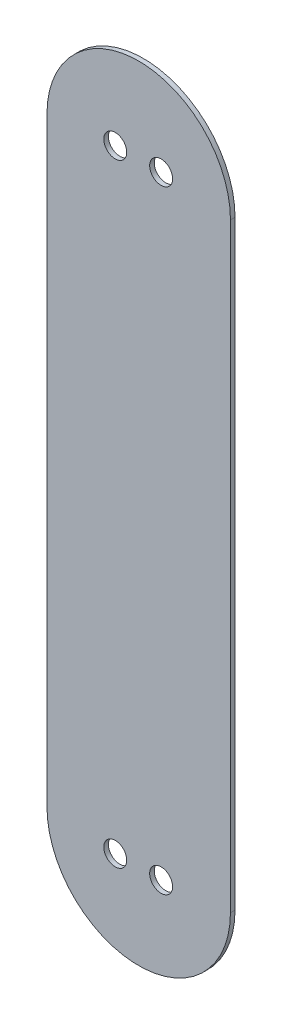
ISO-10303-21;
HEADER;
FILE_DESCRIPTION(('STEP AP214'),'2;1');
FILE_NAME('part.step','',(''),(''),'','','');
FILE_SCHEMA(('AUTOMOTIVE_DESIGN { 1 0 10303 214 1 1 1 1 }'));
ENDSEC;
DATA;
#1=APPLICATION_CONTEXT('core data for automotive mechanical design processes');
#2=APPLICATION_PROTOCOL_DEFINITION('international standard','automotive_design',2000,#1);
#3=PRODUCT_CONTEXT('',#1,'mechanical');
#4=PRODUCT('Part','Part','',(#3));
#5=PRODUCT_RELATED_PRODUCT_CATEGORY('part','',(#4));
#6=PRODUCT_DEFINITION_FORMATION('','',#4);
#7=PRODUCT_DEFINITION_CONTEXT('part definition',#1,'design');
#8=PRODUCT_DEFINITION('design','',#6,#7);
#9=PRODUCT_DEFINITION_SHAPE('','',#8);
#10=(LENGTH_UNIT() NAMED_UNIT(*) SI_UNIT(.MILLI.,.METRE.));
#11=(NAMED_UNIT(*) PLANE_ANGLE_UNIT() SI_UNIT($,.RADIAN.));
#12=(NAMED_UNIT(*) SI_UNIT($,.STERADIAN.) SOLID_ANGLE_UNIT());
#13=UNCERTAINTY_MEASURE_WITH_UNIT(LENGTH_MEASURE(1.E-05),#10,'distance_accuracy_value','');
#14=(GEOMETRIC_REPRESENTATION_CONTEXT(3) GLOBAL_UNCERTAINTY_ASSIGNED_CONTEXT((#13)) GLOBAL_UNIT_ASSIGNED_CONTEXT((#10,
#11,#12)) REPRESENTATION_CONTEXT('',''));
#15=CARTESIAN_POINT('',(0.,0.,0.));
#16=DIRECTION('',(0.,0.,1.));
#17=DIRECTION('',(1.,0.,0.));
#18=AXIS2_PLACEMENT_3D('',#15,#16,#17);
#19=CARTESIAN_POINT('',(12.8,329.89400977705,1.));
#20=DIRECTION('',(0.,0.,1.));
#21=DIRECTION('',(1.,0.,0.));
#22=AXIS2_PLACEMENT_3D('',#19,#20,#21);
#23=PLANE('',#22);
#24=CARTESIAN_POINT('',(17.6883624644838,197.7,1.));
#25=DIRECTION('',(0.,0.,1.));
#26=DIRECTION('',(1.,0.,0.));
#27=AXIS2_PLACEMENT_3D('',#24,#25,#26);
#28=CIRCLE('',#27,2.5);
#29=CARTESIAN_POINT('',(20.1883624644838,197.7,1.));
#30=VERTEX_POINT('',#29);
#31=EDGE_CURVE('E146',#30,#30,#28,.T.);
#32=ORIENTED_EDGE('',*,*,#31,.F.);
#33=EDGE_LOOP('',(#32));
#34=FACE_BOUND('',#33,.T.);
#35=CARTESIAN_POINT('',(17.6883624644838,331.340963798028,1.));
#36=DIRECTION('',(0.,0.,1.));
#37=DIRECTION('',(1.,0.,0.));
#38=AXIS2_PLACEMENT_3D('',#35,#36,#37);
#39=CIRCLE('',#38,2.5);
#40=CARTESIAN_POINT('',(20.1883624644838,331.340963798028,1.));
#41=VERTEX_POINT('',#40);
#42=EDGE_CURVE('E116',#41,#41,#39,.T.);
#43=ORIENTED_EDGE('',*,*,#42,.F.);
#44=EDGE_LOOP('',(#43));
#45=FACE_BOUND('',#44,.T.);
#46=CARTESIAN_POINT('',(12.8,329.89400977705,1.));
#47=DIRECTION('',(0.,0.,1.));
#48=DIRECTION('',(1.,0.,0.));
#49=AXIS2_PLACEMENT_3D('',#46,#47,#48);
#50=CIRCLE('',#49,20.);
#51=CARTESIAN_POINT('',(32.8,329.89400977705,1.));
#52=VERTEX_POINT('',#51);
#53=CARTESIAN_POINT('',(-7.20000000000005,329.89400977705,1.));
#54=VERTEX_POINT('',#53);
#55=EDGE_CURVE('E96',#52,#54,#50,.T.);
#56=ORIENTED_EDGE('',*,*,#55,.T.);
#57=DIRECTION('',(0.,-1.,0.));
#58=VECTOR('',#57,1.);
#59=CARTESIAN_POINT('',(-7.20000000000005,329.89400977705,1.));
#60=LINE('',#59,#58);
#61=CARTESIAN_POINT('',(-7.20000000000003,199.1,1.));
#62=VERTEX_POINT('',#61);
#63=EDGE_CURVE('E91',#54,#62,#60,.T.);
#64=ORIENTED_EDGE('',*,*,#63,.T.);
#65=CARTESIAN_POINT('',(12.8,199.1,1.));
#66=DIRECTION('',(0.,0.,1.));
#67=DIRECTION('',(1.,0.,0.));
#68=AXIS2_PLACEMENT_3D('',#65,#66,#67);
#69=CIRCLE('',#68,20.);
#70=CARTESIAN_POINT('',(32.8,199.1,1.));
#71=VERTEX_POINT('',#70);
#72=EDGE_CURVE('E94',#62,#71,#69,.T.);
#73=ORIENTED_EDGE('',*,*,#72,.T.);
#74=DIRECTION('',(0.,1.,0.));
#75=VECTOR('',#74,1.);
#76=CARTESIAN_POINT('',(32.8,329.89400977705,1.));
#77=LINE('',#76,#75);
#78=EDGE_CURVE('E61',#71,#52,#77,.T.);
#79=ORIENTED_EDGE('',*,*,#78,.T.);
#80=EDGE_LOOP('',(#56,#64,#73,#79));
#81=FACE_BOUND('',#80,.T.);
#82=CARTESIAN_POINT('',(7.68836246448382,331.340963798028,1.));
#83=DIRECTION('',(0.,0.,1.));
#84=DIRECTION('',(1.,0.,0.));
#85=AXIS2_PLACEMENT_3D('',#82,#83,#84);
#86=CIRCLE('',#85,2.5);
#87=CARTESIAN_POINT('',(10.1883624644838,331.340963798028,1.));
#88=VERTEX_POINT('',#87);
#89=EDGE_CURVE('E138',#88,#88,#86,.T.);
#90=ORIENTED_EDGE('',*,*,#89,.F.);
#91=EDGE_LOOP('',(#90));
#92=FACE_BOUND('',#91,.T.);
#93=CARTESIAN_POINT('',(7.68836246448382,197.7,1.));
#94=DIRECTION('',(0.,0.,1.));
#95=DIRECTION('',(1.,0.,0.));
#96=AXIS2_PLACEMENT_3D('',#93,#94,#95);
#97=CIRCLE('',#96,2.5);
#98=CARTESIAN_POINT('',(10.1883624644838,197.7,1.));
#99=VERTEX_POINT('',#98);
#100=EDGE_CURVE('E154',#99,#99,#97,.T.);
#101=ORIENTED_EDGE('',*,*,#100,.F.);
#102=EDGE_LOOP('',(#101));
#103=FACE_BOUND('',#102,.T.);
#104=ADVANCED_FACE('F43',(#34,#45,#81,#92,#103),#23,.T.);
#105=CARTESIAN_POINT('',(12.8,329.89400977705,0.));
#106=DIRECTION('',(0.,0.,1.));
#107=DIRECTION('',(1.,0.,0.));
#108=AXIS2_PLACEMENT_3D('',#105,#106,#107);
#109=PLANE('',#108);
#110=CARTESIAN_POINT('',(12.8,329.89400977705,0.));
#111=DIRECTION('',(0.,0.,1.));
#112=DIRECTION('',(1.,0.,0.));
#113=AXIS2_PLACEMENT_3D('',#110,#111,#112);
#114=CIRCLE('',#113,20.);
#115=CARTESIAN_POINT('',(32.8,329.89400977705,0.));
#116=VERTEX_POINT('',#115);
#117=CARTESIAN_POINT('',(-7.20000000000005,329.89400977705,0.));
#118=VERTEX_POINT('',#117);
#119=EDGE_CURVE('E112',#116,#118,#114,.T.);
#120=ORIENTED_EDGE('',*,*,#119,.F.);
#121=DIRECTION('',(0.,1.,0.));
#122=VECTOR('',#121,1.);
#123=CARTESIAN_POINT('',(32.8,329.89400977705,0.));
#124=LINE('',#123,#122);
#125=CARTESIAN_POINT('',(32.8,199.1,0.));
#126=VERTEX_POINT('',#125);
#127=EDGE_CURVE('E84',#126,#116,#124,.T.);
#128=ORIENTED_EDGE('',*,*,#127,.F.);
#129=CARTESIAN_POINT('',(12.8,199.1,0.));
#130=DIRECTION('',(0.,0.,1.));
#131=DIRECTION('',(1.,0.,0.));
#132=AXIS2_PLACEMENT_3D('',#129,#130,#131);
#133=CIRCLE('',#132,20.);
#134=CARTESIAN_POINT('',(-7.20000000000003,199.1,0.));
#135=VERTEX_POINT('',#134);
#136=EDGE_CURVE('E78',#135,#126,#133,.T.);
#137=ORIENTED_EDGE('',*,*,#136,.F.);
#138=DIRECTION('',(0.,-1.,0.));
#139=VECTOR('',#138,1.);
#140=CARTESIAN_POINT('',(-7.20000000000005,329.89400977705,0.));
#141=LINE('',#140,#139);
#142=EDGE_CURVE('E101',#118,#135,#141,.T.);
#143=ORIENTED_EDGE('',*,*,#142,.F.);
#144=EDGE_LOOP('',(#120,#128,#137,#143));
#145=FACE_BOUND('',#144,.T.);
#146=CARTESIAN_POINT('',(17.6883624644838,331.340963798028,0.));
#147=DIRECTION('',(0.,0.,1.));
#148=DIRECTION('',(1.,0.,0.));
#149=AXIS2_PLACEMENT_3D('',#146,#147,#148);
#150=CIRCLE('',#149,2.5);
#151=CARTESIAN_POINT('',(20.1883624644838,331.340963798028,0.));
#152=VERTEX_POINT('',#151);
#153=EDGE_CURVE('E134',#152,#152,#150,.T.);
#154=ORIENTED_EDGE('',*,*,#153,.T.);
#155=EDGE_LOOP('',(#154));
#156=FACE_BOUND('',#155,.T.);
#157=CARTESIAN_POINT('',(7.68836246448382,331.340963798028,0.));
#158=DIRECTION('',(0.,0.,1.));
#159=DIRECTION('',(1.,0.,0.));
#160=AXIS2_PLACEMENT_3D('',#157,#158,#159);
#161=CIRCLE('',#160,2.5);
#162=CARTESIAN_POINT('',(10.1883624644838,331.340963798028,0.));
#163=VERTEX_POINT('',#162);
#164=EDGE_CURVE('E142',#163,#163,#161,.T.);
#165=ORIENTED_EDGE('',*,*,#164,.T.);
#166=EDGE_LOOP('',(#165));
#167=FACE_BOUND('',#166,.T.);
#168=CARTESIAN_POINT('',(17.6883624644838,197.7,0.));
#169=DIRECTION('',(0.,0.,1.));
#170=DIRECTION('',(1.,0.,0.));
#171=AXIS2_PLACEMENT_3D('',#168,#169,#170);
#172=CIRCLE('',#171,2.5);
#173=CARTESIAN_POINT('',(20.1883624644838,197.7,0.));
#174=VERTEX_POINT('',#173);
#175=EDGE_CURVE('E150',#174,#174,#172,.T.);
#176=ORIENTED_EDGE('',*,*,#175,.T.);
#177=EDGE_LOOP('',(#176));
#178=FACE_BOUND('',#177,.T.);
#179=CARTESIAN_POINT('',(7.68836246448382,197.7,0.));
#180=DIRECTION('',(0.,0.,1.));
#181=DIRECTION('',(1.,0.,0.));
#182=AXIS2_PLACEMENT_3D('',#179,#180,#181);
#183=CIRCLE('',#182,2.5);
#184=CARTESIAN_POINT('',(10.1883624644838,197.7,0.));
#185=VERTEX_POINT('',#184);
#186=EDGE_CURVE('E158',#185,#185,#183,.T.);
#187=ORIENTED_EDGE('',*,*,#186,.T.);
#188=EDGE_LOOP('',(#187));
#189=FACE_BOUND('',#188,.T.);
#190=ADVANCED_FACE('F129',(#145,#156,#167,#178,#189),#109,.F.);
#191=CARTESIAN_POINT('',(12.8,329.89400977705,1.));
#192=DIRECTION('',(0.,0.,-1.));
#193=DIRECTION('',(-1.,0.,0.));
#194=AXIS2_PLACEMENT_3D('',#191,#192,#193);
#195=CYLINDRICAL_SURFACE('',#194,20.);
#196=ORIENTED_EDGE('',*,*,#119,.T.);
#197=DIRECTION('',(0.,0.,-1.));
#198=VECTOR('',#197,1.);
#199=CARTESIAN_POINT('',(-7.20000000000005,329.89400977705,1.));
#200=LINE('',#199,#198);
#201=EDGE_CURVE('E11',#54,#118,#200,.T.);
#202=ORIENTED_EDGE('',*,*,#201,.F.);
#203=ORIENTED_EDGE('',*,*,#55,.F.);
#204=DIRECTION('',(0.,0.,-1.));
#205=VECTOR('',#204,1.);
#206=CARTESIAN_POINT('',(32.8,329.89400977705,1.));
#207=LINE('',#206,#205);
#208=EDGE_CURVE('E108',#52,#116,#207,.T.);
#209=ORIENTED_EDGE('',*,*,#208,.T.);
#210=EDGE_LOOP('',(#196,#202,#203,#209));
#211=FACE_BOUND('',#210,.T.);
#212=ADVANCED_FACE('F45',(#211),#195,.T.);
#213=CARTESIAN_POINT('',(-7.20000000000005,329.89400977705,1.));
#214=DIRECTION('',(1.,0.,0.));
#215=DIRECTION('',(0.,1.,0.));
#216=AXIS2_PLACEMENT_3D('',#213,#214,#215);
#217=PLANE('',#216);
#218=ORIENTED_EDGE('',*,*,#142,.T.);
#219=DIRECTION('',(0.,0.,-1.));
#220=VECTOR('',#219,1.);
#221=CARTESIAN_POINT('',(-7.20000000000003,199.1,1.));
#222=LINE('',#221,#220);
#223=EDGE_CURVE('E53',#62,#135,#222,.T.);
#224=ORIENTED_EDGE('',*,*,#223,.F.);
#225=ORIENTED_EDGE('',*,*,#63,.F.);
#226=ORIENTED_EDGE('',*,*,#201,.T.);
#227=EDGE_LOOP('',(#218,#224,#225,#226));
#228=FACE_BOUND('',#227,.T.);
#229=ADVANCED_FACE('F100',(#228),#217,.F.);
#230=CARTESIAN_POINT('',(12.8,199.1,1.));
#231=DIRECTION('',(0.,0.,-1.));
#232=DIRECTION('',(-1.,0.,0.));
#233=AXIS2_PLACEMENT_3D('',#230,#231,#232);
#234=CYLINDRICAL_SURFACE('',#233,20.);
#235=ORIENTED_EDGE('',*,*,#136,.T.);
#236=DIRECTION('',(0.,0.,-1.));
#237=VECTOR('',#236,1.);
#238=CARTESIAN_POINT('',(32.8,199.1,1.));
#239=LINE('',#238,#237);
#240=EDGE_CURVE('E103',#71,#126,#239,.T.);
#241=ORIENTED_EDGE('',*,*,#240,.F.);
#242=ORIENTED_EDGE('',*,*,#72,.F.);
#243=ORIENTED_EDGE('',*,*,#223,.T.);
#244=EDGE_LOOP('',(#235,#241,#242,#243));
#245=FACE_BOUND('',#244,.T.);
#246=ADVANCED_FACE('F104',(#245),#234,.T.);
#247=CARTESIAN_POINT('',(32.8,329.89400977705,1.));
#248=DIRECTION('',(-1.,0.,0.));
#249=DIRECTION('',(0.,-1.,0.));
#250=AXIS2_PLACEMENT_3D('',#247,#248,#249);
#251=PLANE('',#250);
#252=ORIENTED_EDGE('',*,*,#127,.T.);
#253=ORIENTED_EDGE('',*,*,#208,.F.);
#254=ORIENTED_EDGE('',*,*,#78,.F.);
#255=ORIENTED_EDGE('',*,*,#240,.T.);
#256=EDGE_LOOP('',(#252,#253,#254,#255));
#257=FACE_BOUND('',#256,.T.);
#258=ADVANCED_FACE('F126',(#257),#251,.F.);
#259=CARTESIAN_POINT('',(17.6883624644838,331.340963798028,1.));
#260=DIRECTION('',(0.,0.,-1.));
#261=DIRECTION('',(-1.,0.,0.));
#262=AXIS2_PLACEMENT_3D('',#259,#260,#261);
#263=CYLINDRICAL_SURFACE('',#262,2.5);
#264=ORIENTED_EDGE('',*,*,#42,.T.);
#265=EDGE_LOOP('',(#264));
#266=FACE_BOUND('',#265,.T.);
#267=ORIENTED_EDGE('',*,*,#153,.F.);
#268=EDGE_LOOP('',(#267));
#269=FACE_BOUND('',#268,.T.);
#270=ADVANCED_FACE('F179',(#266,#269),#263,.F.);
#271=CARTESIAN_POINT('',(7.68836246448382,331.340963798028,1.));
#272=DIRECTION('',(0.,0.,-1.));
#273=DIRECTION('',(-1.,0.,0.));
#274=AXIS2_PLACEMENT_3D('',#271,#272,#273);
#275=CYLINDRICAL_SURFACE('',#274,2.5);
#276=ORIENTED_EDGE('',*,*,#89,.T.);
#277=EDGE_LOOP('',(#276));
#278=FACE_BOUND('',#277,.T.);
#279=ORIENTED_EDGE('',*,*,#164,.F.);
#280=EDGE_LOOP('',(#279));
#281=FACE_BOUND('',#280,.T.);
#282=ADVANCED_FACE('F233',(#278,#281),#275,.F.);
#283=CARTESIAN_POINT('',(17.6883624644838,197.7,1.));
#284=DIRECTION('',(0.,0.,-1.));
#285=DIRECTION('',(-1.,0.,0.));
#286=AXIS2_PLACEMENT_3D('',#283,#284,#285);
#287=CYLINDRICAL_SURFACE('',#286,2.5);
#288=ORIENTED_EDGE('',*,*,#31,.T.);
#289=EDGE_LOOP('',(#288));
#290=FACE_BOUND('',#289,.T.);
#291=ORIENTED_EDGE('',*,*,#175,.F.);
#292=EDGE_LOOP('',(#291));
#293=FACE_BOUND('',#292,.T.);
#294=ADVANCED_FACE('F242',(#290,#293),#287,.F.);
#295=CARTESIAN_POINT('',(7.68836246448382,197.7,1.));
#296=DIRECTION('',(0.,0.,-1.));
#297=DIRECTION('',(-1.,0.,0.));
#298=AXIS2_PLACEMENT_3D('',#295,#296,#297);
#299=CYLINDRICAL_SURFACE('',#298,2.5);
#300=ORIENTED_EDGE('',*,*,#100,.T.);
#301=EDGE_LOOP('',(#300));
#302=FACE_BOUND('',#301,.T.);
#303=ORIENTED_EDGE('',*,*,#186,.F.);
#304=EDGE_LOOP('',(#303));
#305=FACE_BOUND('',#304,.T.);
#306=ADVANCED_FACE('F166',(#302,#305),#299,.F.);
#307=CLOSED_SHELL('',(#104,#190,#212,#229,#246,#258,#270,#282,#294,#306));
#308=MANIFOLD_SOLID_BREP('B2',#307);
#309=ADVANCED_BREP_SHAPE_REPRESENTATION('',(#18,#308),#14);
#310=SHAPE_DEFINITION_REPRESENTATION(#9,#309);
ENDSEC;
END-ISO-10303-21;
